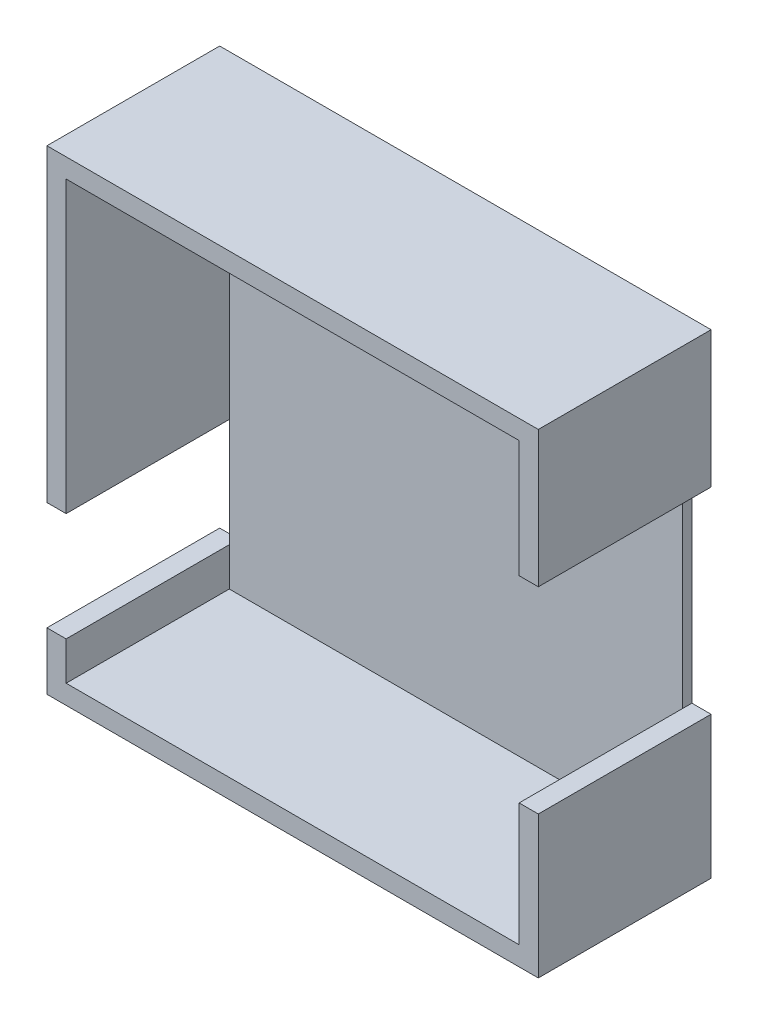
ISO-10303-21;
HEADER;
FILE_DESCRIPTION(('STEP AP214'),'2;1');
FILE_NAME('part.step','',(''),(''),'','','');
FILE_SCHEMA(('AUTOMOTIVE_DESIGN { 1 0 10303 214 1 1 1 1 }'));
ENDSEC;
DATA;
#1=APPLICATION_CONTEXT('core data for automotive mechanical design processes');
#2=APPLICATION_PROTOCOL_DEFINITION('international standard','automotive_design',2000,#1);
#3=PRODUCT_CONTEXT('',#1,'mechanical');
#4=PRODUCT('Part','Part','',(#3));
#5=PRODUCT_RELATED_PRODUCT_CATEGORY('part','',(#4));
#6=PRODUCT_DEFINITION_FORMATION('','',#4);
#7=PRODUCT_DEFINITION_CONTEXT('part definition',#1,'design');
#8=PRODUCT_DEFINITION('design','',#6,#7);
#9=PRODUCT_DEFINITION_SHAPE('','',#8);
#10=(LENGTH_UNIT() NAMED_UNIT(*) SI_UNIT(.MILLI.,.METRE.));
#11=(NAMED_UNIT(*) PLANE_ANGLE_UNIT() SI_UNIT($,.RADIAN.));
#12=(NAMED_UNIT(*) SI_UNIT($,.STERADIAN.) SOLID_ANGLE_UNIT());
#13=UNCERTAINTY_MEASURE_WITH_UNIT(LENGTH_MEASURE(1.E-05),#10,'distance_accuracy_value','');
#14=(GEOMETRIC_REPRESENTATION_CONTEXT(3) GLOBAL_UNCERTAINTY_ASSIGNED_CONTEXT((#13)) GLOBAL_UNIT_ASSIGNED_CONTEXT((#10,
#11,#12)) REPRESENTATION_CONTEXT('',''));
#15=CARTESIAN_POINT('',(0.,0.,0.));
#16=DIRECTION('',(0.,0.,1.));
#17=DIRECTION('',(1.,0.,0.));
#18=AXIS2_PLACEMENT_3D('',#15,#16,#17);
#19=CARTESIAN_POINT('',(0.,0.,17.));
#20=DIRECTION('',(0.,0.,1.));
#21=DIRECTION('',(1.,0.,0.));
#22=AXIS2_PLACEMENT_3D('',#19,#20,#21);
#23=PLANE('',#22);
#24=DIRECTION('',(1.,0.,0.));
#25=VECTOR('',#24,1.);
#26=CARTESIAN_POINT('',(25.47798502867,-32.8376623376623,17.));
#27=LINE('',#26,#25);
#28=CARTESIAN_POINT('',(23.47798502867,-32.8376623376623,17.));
#29=VERTEX_POINT('',#28);
#30=CARTESIAN_POINT('',(25.47798502867,-32.8376623376623,17.));
#31=VERTEX_POINT('',#30);
#32=EDGE_CURVE('E180',#29,#31,#27,.T.);
#33=ORIENTED_EDGE('',*,*,#32,.F.);
#34=DIRECTION('',(0.,1.,0.));
#35=VECTOR('',#34,1.);
#36=CARTESIAN_POINT('',(23.47798502867,-0.137662337662325,17.));
#37=LINE('',#36,#35);
#38=CARTESIAN_POINT('',(23.47798502867,-45.6376623376623,17.));
#39=VERTEX_POINT('',#38);
#40=EDGE_CURVE('E275',#39,#29,#37,.T.);
#41=ORIENTED_EDGE('',*,*,#40,.F.);
#42=DIRECTION('',(1.,0.,0.));
#43=VECTOR('',#42,1.);
#44=CARTESIAN_POINT('',(-23.72201497133,-45.6376623376623,17.));
#45=LINE('',#44,#43);
#46=CARTESIAN_POINT('',(-23.72201497133,-45.6376623376623,17.));
#47=VERTEX_POINT('',#46);
#48=EDGE_CURVE('E271',#47,#39,#45,.T.);
#49=ORIENTED_EDGE('',*,*,#48,.F.);
#50=DIRECTION('',(0.,-1.,0.));
#51=VECTOR('',#50,1.);
#52=CARTESIAN_POINT('',(-23.72201497133,-0.137662337662324,17.));
#53=LINE('',#52,#51);
#54=CARTESIAN_POINT('',(-23.72201497133,-41.6376623376623,17.));
#55=VERTEX_POINT('',#54);
#56=EDGE_CURVE('E272',#55,#47,#53,.T.);
#57=ORIENTED_EDGE('',*,*,#56,.F.);
#58=DIRECTION('',(1.,0.,0.));
#59=VECTOR('',#58,1.);
#60=CARTESIAN_POINT('',(-23.72201497133,-41.6376623376623,17.));
#61=LINE('',#60,#59);
#62=CARTESIAN_POINT('',(-25.72201497133,-41.6376623376623,17.));
#63=VERTEX_POINT('',#62);
#64=EDGE_CURVE('E325',#63,#55,#61,.T.);
#65=ORIENTED_EDGE('',*,*,#64,.F.);
#66=DIRECTION('',(0.,-1.,0.));
#67=VECTOR('',#66,1.);
#68=CARTESIAN_POINT('',(-25.72201497133,1.86233766233768,17.));
#69=LINE('',#68,#67);
#70=CARTESIAN_POINT('',(-25.72201497133,-47.6376623376623,17.));
#71=VERTEX_POINT('',#70);
#72=EDGE_CURVE('E312',#63,#71,#69,.T.);
#73=ORIENTED_EDGE('',*,*,#72,.T.);
#74=DIRECTION('',(1.,0.,0.));
#75=VECTOR('',#74,1.);
#76=CARTESIAN_POINT('',(-25.72201497133,-47.6376623376623,17.));
#77=LINE('',#76,#75);
#78=CARTESIAN_POINT('',(25.47798502867,-47.6376623376623,17.));
#79=VERTEX_POINT('',#78);
#80=EDGE_CURVE('E198',#71,#79,#77,.T.);
#81=ORIENTED_EDGE('',*,*,#80,.T.);
#82=DIRECTION('',(0.,1.,0.));
#83=VECTOR('',#82,1.);
#84=CARTESIAN_POINT('',(25.47798502867,1.86233766233768,17.));
#85=LINE('',#84,#83);
#86=EDGE_CURVE('E197',#79,#31,#85,.T.);
#87=ORIENTED_EDGE('',*,*,#86,.T.);
#88=EDGE_LOOP('',(#33,#41,#49,#57,#65,#73,#81,#87));
#89=FACE_BOUND('',#88,.T.);
#90=ADVANCED_FACE('F45',(#89),#23,.T.);
#91=CARTESIAN_POINT('',(-25.72201497133,1.86233766233768,17.));
#92=DIRECTION('',(1.,0.,0.));
#93=DIRECTION('',(0.,1.,0.));
#94=AXIS2_PLACEMENT_3D('',#91,#92,#93);
#95=PLANE('',#94);
#96=ORIENTED_EDGE('',*,*,#72,.F.);
#97=DIRECTION('',(0.,0.,1.));
#98=VECTOR('',#97,1.);
#99=CARTESIAN_POINT('',(-25.72201497133,-41.6376623376623,-2.));
#100=LINE('',#99,#98);
#101=CARTESIAN_POINT('',(-25.72201497133,-41.6376623376623,-1.));
#102=VERTEX_POINT('',#101);
#103=EDGE_CURVE('E336',#102,#63,#100,.T.);
#104=ORIENTED_EDGE('',*,*,#103,.F.);
#105=DIRECTION('',(0.,1.,0.));
#106=VECTOR('',#105,1.);
#107=CARTESIAN_POINT('',(-25.72201497133,1.86233766233767,-1.));
#108=LINE('',#107,#106);
#109=CARTESIAN_POINT('',(-25.72201497133,-47.6376623376623,-1.00000000000001));
#110=VERTEX_POINT('',#109);
#111=EDGE_CURVE('E259',#110,#102,#108,.T.);
#112=ORIENTED_EDGE('',*,*,#111,.F.);
#113=DIRECTION('',(0.,0.,-1.));
#114=VECTOR('',#113,1.);
#115=CARTESIAN_POINT('',(-25.72201497133,-47.6376623376623,17.));
#116=LINE('',#115,#114);
#117=EDGE_CURVE('E219',#71,#110,#116,.T.);
#118=ORIENTED_EDGE('',*,*,#117,.F.);
#119=EDGE_LOOP('',(#96,#104,#112,#118));
#120=FACE_BOUND('',#119,.T.);
#121=ADVANCED_FACE('F334',(#120),#95,.F.);
#122=CARTESIAN_POINT('',(25.47798502867,1.86233766233768,17.));
#123=DIRECTION('',(-1.,0.,0.));
#124=DIRECTION('',(0.,-1.,0.));
#125=AXIS2_PLACEMENT_3D('',#122,#123,#124);
#126=PLANE('',#125);
#127=DIRECTION('',(0.,1.,0.));
#128=VECTOR('',#127,1.);
#129=CARTESIAN_POINT('',(25.47798502867,1.86233766233768,-1.));
#130=LINE('',#129,#128);
#131=CARTESIAN_POINT('',(25.47798502867,-47.6376623376623,-1.00000000000001));
#132=VERTEX_POINT('',#131);
#133=CARTESIAN_POINT('',(25.47798502867,-32.8376623376623,-1.));
#134=VERTEX_POINT('',#133);
#135=EDGE_CURVE('E248',#132,#134,#130,.T.);
#136=ORIENTED_EDGE('',*,*,#135,.T.);
#137=DIRECTION('',(0.,0.,1.));
#138=VECTOR('',#137,1.);
#139=CARTESIAN_POINT('',(25.47798502867,-32.8376623376623,-2.));
#140=LINE('',#139,#138);
#141=EDGE_CURVE('E419',#134,#31,#140,.T.);
#142=ORIENTED_EDGE('',*,*,#141,.T.);
#143=ORIENTED_EDGE('',*,*,#86,.F.);
#144=DIRECTION('',(0.,0.,-1.));
#145=VECTOR('',#144,1.);
#146=CARTESIAN_POINT('',(25.47798502867,-47.6376623376623,17.));
#147=LINE('',#146,#145);
#148=EDGE_CURVE('E216',#79,#132,#147,.T.);
#149=ORIENTED_EDGE('',*,*,#148,.T.);
#150=EDGE_LOOP('',(#136,#142,#143,#149));
#151=FACE_BOUND('',#150,.T.);
#152=ADVANCED_FACE('F360',(#151),#126,.F.);
#153=CARTESIAN_POINT('',(-23.72201497133,-0.137662337662324,17.));
#154=DIRECTION('',(1.,0.,0.));
#155=DIRECTION('',(0.,1.,0.));
#156=AXIS2_PLACEMENT_3D('',#153,#154,#155);
#157=PLANE('',#156);
#158=DIRECTION('',(0.,0.,1.));
#159=VECTOR('',#158,1.);
#160=CARTESIAN_POINT('',(-23.72201497133,-41.6376623376623,-2.));
#161=LINE('',#160,#159);
#162=CARTESIAN_POINT('',(-23.72201497133,-41.6376623376623,0.));
#163=VERTEX_POINT('',#162);
#164=EDGE_CURVE('E410',#163,#55,#161,.T.);
#165=ORIENTED_EDGE('',*,*,#164,.T.);
#166=ORIENTED_EDGE('',*,*,#56,.T.);
#167=DIRECTION('',(0.,0.,-1.));
#168=VECTOR('',#167,1.);
#169=CARTESIAN_POINT('',(-23.72201497133,-45.6376623376623,17.));
#170=LINE('',#169,#168);
#171=CARTESIAN_POINT('',(-23.72201497133,-45.6376623376623,0.));
#172=VERTEX_POINT('',#171);
#173=EDGE_CURVE('E309',#47,#172,#170,.T.);
#174=ORIENTED_EDGE('',*,*,#173,.T.);
#175=DIRECTION('',(0.,-1.,0.));
#176=VECTOR('',#175,1.);
#177=CARTESIAN_POINT('',(-23.72201497133,-0.137662337662324,0.));
#178=LINE('',#177,#176);
#179=EDGE_CURVE('E262',#163,#172,#178,.T.);
#180=ORIENTED_EDGE('',*,*,#179,.F.);
#181=EDGE_LOOP('',(#165,#166,#174,#180));
#182=FACE_BOUND('',#181,.T.);
#183=ADVANCED_FACE('F357',(#182),#157,.T.);
#184=CARTESIAN_POINT('',(23.47798502867,-0.137662337662325,17.));
#185=DIRECTION('',(-1.,0.,0.));
#186=DIRECTION('',(0.,-1.,0.));
#187=AXIS2_PLACEMENT_3D('',#184,#185,#186);
#188=PLANE('',#187);
#189=DIRECTION('',(0.,0.,1.));
#190=VECTOR('',#189,1.);
#191=CARTESIAN_POINT('',(23.47798502867,-32.8376623376623,-2.));
#192=LINE('',#191,#190);
#193=CARTESIAN_POINT('',(23.47798502867,-32.8376623376623,0.));
#194=VERTEX_POINT('',#193);
#195=EDGE_CURVE('E397',#194,#29,#192,.T.);
#196=ORIENTED_EDGE('',*,*,#195,.F.);
#197=DIRECTION('',(0.,1.,0.));
#198=VECTOR('',#197,1.);
#199=CARTESIAN_POINT('',(23.47798502867,-0.137662337662325,0.));
#200=LINE('',#199,#198);
#201=CARTESIAN_POINT('',(23.47798502867,-45.6376623376623,0.));
#202=VERTEX_POINT('',#201);
#203=EDGE_CURVE('E292',#202,#194,#200,.T.);
#204=ORIENTED_EDGE('',*,*,#203,.F.);
#205=DIRECTION('',(0.,0.,-1.));
#206=VECTOR('',#205,1.);
#207=CARTESIAN_POINT('',(23.47798502867,-45.6376623376623,17.));
#208=LINE('',#207,#206);
#209=EDGE_CURVE('E306',#39,#202,#208,.T.);
#210=ORIENTED_EDGE('',*,*,#209,.F.);
#211=ORIENTED_EDGE('',*,*,#40,.T.);
#212=EDGE_LOOP('',(#196,#204,#210,#211));
#213=FACE_BOUND('',#212,.T.);
#214=ADVANCED_FACE('F368',(#213),#188,.T.);
#215=DIRECTION('',(-1.,0.,0.));
#216=VECTOR('',#215,1.);
#217=CARTESIAN_POINT('',(25.47798502867,-12.3376623376623,17.));
#218=LINE('',#217,#216);
#219=CARTESIAN_POINT('',(25.47798502867,-12.3376623376623,17.));
#220=VERTEX_POINT('',#219);
#221=CARTESIAN_POINT('',(23.47798502867,-12.3376623376623,17.));
#222=VERTEX_POINT('',#221);
#223=EDGE_CURVE('E171',#220,#222,#218,.T.);
#224=ORIENTED_EDGE('',*,*,#223,.F.);
#225=CARTESIAN_POINT('',(25.47798502867,1.86233766233768,17.));
#226=VERTEX_POINT('',#225);
#227=EDGE_CURVE('E185',#220,#226,#85,.T.);
#228=ORIENTED_EDGE('',*,*,#227,.T.);
#229=DIRECTION('',(-1.,0.,0.));
#230=VECTOR('',#229,1.);
#231=CARTESIAN_POINT('',(-25.72201497133,1.86233766233768,17.));
#232=LINE('',#231,#230);
#233=CARTESIAN_POINT('',(-25.72201497133,1.86233766233768,17.));
#234=VERTEX_POINT('',#233);
#235=EDGE_CURVE('E203',#226,#234,#232,.T.);
#236=ORIENTED_EDGE('',*,*,#235,.T.);
#237=CARTESIAN_POINT('',(-25.72201497133,-30.3376623376623,17.));
#238=VERTEX_POINT('',#237);
#239=EDGE_CURVE('E204',#234,#238,#69,.T.);
#240=ORIENTED_EDGE('',*,*,#239,.T.);
#241=DIRECTION('',(-1.,0.,0.));
#242=VECTOR('',#241,1.);
#243=CARTESIAN_POINT('',(-23.72201497133,-30.3376623376623,17.));
#244=LINE('',#243,#242);
#245=CARTESIAN_POINT('',(-23.72201497133,-30.3376623376623,17.));
#246=VERTEX_POINT('',#245);
#247=EDGE_CURVE('E190',#246,#238,#244,.T.);
#248=ORIENTED_EDGE('',*,*,#247,.F.);
#249=CARTESIAN_POINT('',(-23.72201497133,-0.137662337662324,17.));
#250=VERTEX_POINT('',#249);
#251=EDGE_CURVE('E267',#250,#246,#53,.T.);
#252=ORIENTED_EDGE('',*,*,#251,.F.);
#253=DIRECTION('',(-1.,0.,0.));
#254=VECTOR('',#253,1.);
#255=CARTESIAN_POINT('',(-23.72201497133,-0.137662337662324,17.));
#256=LINE('',#255,#254);
#257=CARTESIAN_POINT('',(23.47798502867,-0.137662337662325,17.));
#258=VERTEX_POINT('',#257);
#259=EDGE_CURVE('E279',#258,#250,#256,.T.);
#260=ORIENTED_EDGE('',*,*,#259,.F.);
#261=EDGE_CURVE('E188',#222,#258,#37,.T.);
#262=ORIENTED_EDGE('',*,*,#261,.F.);
#263=EDGE_LOOP('',(#224,#228,#236,#240,#248,#252,#260,#262));
#264=FACE_BOUND('',#263,.T.);
#265=ADVANCED_FACE('F184',(#264),#23,.T.);
#266=CARTESIAN_POINT('',(-25.72201497133,-30.3376623376623,-1.));
#267=VERTEX_POINT('',#266);
#268=CARTESIAN_POINT('',(-25.72201497133,1.86233766233767,-1.));
#269=VERTEX_POINT('',#268);
#270=EDGE_CURVE('E254',#267,#269,#108,.T.);
#271=ORIENTED_EDGE('',*,*,#270,.F.);
#272=DIRECTION('',(0.,0.,1.));
#273=VECTOR('',#272,1.);
#274=CARTESIAN_POINT('',(-25.72201497133,-30.3376623376623,-2.));
#275=LINE('',#274,#273);
#276=EDGE_CURVE('E69',#267,#238,#275,.T.);
#277=ORIENTED_EDGE('',*,*,#276,.T.);
#278=ORIENTED_EDGE('',*,*,#239,.F.);
#279=DIRECTION('',(0.,0.,-1.));
#280=VECTOR('',#279,1.);
#281=CARTESIAN_POINT('',(-25.72201497133,1.86233766233768,17.));
#282=LINE('',#281,#280);
#283=EDGE_CURVE('E210',#234,#269,#282,.T.);
#284=ORIENTED_EDGE('',*,*,#283,.T.);
#285=EDGE_LOOP('',(#271,#277,#278,#284));
#286=FACE_BOUND('',#285,.T.);
#287=ADVANCED_FACE('F47',(#286),#95,.F.);
#288=CARTESIAN_POINT('',(-25.72201497133,-47.6376623376623,17.));
#289=DIRECTION('',(0.,1.,0.));
#290=DIRECTION('',(0.,0.,1.));
#291=AXIS2_PLACEMENT_3D('',#288,#289,#290);
#292=PLANE('',#291);
#293=ORIENTED_EDGE('',*,*,#117,.T.);
#294=DIRECTION('',(1.,0.,0.));
#295=VECTOR('',#294,1.);
#296=CARTESIAN_POINT('',(-25.72201497133,-47.6376623376623,-1.00000000000001));
#297=LINE('',#296,#295);
#298=EDGE_CURVE('E263',#110,#132,#297,.T.);
#299=ORIENTED_EDGE('',*,*,#298,.T.);
#300=ORIENTED_EDGE('',*,*,#148,.F.);
#301=ORIENTED_EDGE('',*,*,#80,.F.);
#302=EDGE_LOOP('',(#293,#299,#300,#301));
#303=FACE_BOUND('',#302,.T.);
#304=ADVANCED_FACE('F330',(#303),#292,.F.);
#305=ORIENTED_EDGE('',*,*,#227,.F.);
#306=DIRECTION('',(0.,0.,1.));
#307=VECTOR('',#306,1.);
#308=CARTESIAN_POINT('',(25.47798502867,-12.3376623376623,-2.));
#309=LINE('',#308,#307);
#310=CARTESIAN_POINT('',(25.47798502867,-12.3376623376623,-1.));
#311=VERTEX_POINT('',#310);
#312=EDGE_CURVE('E168',#311,#220,#309,.T.);
#313=ORIENTED_EDGE('',*,*,#312,.F.);
#314=CARTESIAN_POINT('',(25.47798502867,1.86233766233768,-1.));
#315=VERTEX_POINT('',#314);
#316=EDGE_CURVE('E244',#311,#315,#130,.T.);
#317=ORIENTED_EDGE('',*,*,#316,.T.);
#318=DIRECTION('',(0.,0.,-1.));
#319=VECTOR('',#318,1.);
#320=CARTESIAN_POINT('',(25.47798502867,1.86233766233768,17.));
#321=LINE('',#320,#319);
#322=EDGE_CURVE('E194',#226,#315,#321,.T.);
#323=ORIENTED_EDGE('',*,*,#322,.F.);
#324=EDGE_LOOP('',(#305,#313,#317,#323));
#325=FACE_BOUND('',#324,.T.);
#326=ADVANCED_FACE('F192',(#325),#126,.F.);
#327=CARTESIAN_POINT('',(-25.72201497133,1.86233766233768,17.));
#328=DIRECTION('',(0.,-1.,0.));
#329=DIRECTION('',(0.,0.,-1.));
#330=AXIS2_PLACEMENT_3D('',#327,#328,#329);
#331=PLANE('',#330);
#332=ORIENTED_EDGE('',*,*,#322,.T.);
#333=DIRECTION('',(1.,0.,0.));
#334=VECTOR('',#333,1.);
#335=CARTESIAN_POINT('',(-25.72201497133,1.86233766233767,-1.));
#336=LINE('',#335,#334);
#337=EDGE_CURVE('E246',#269,#315,#336,.T.);
#338=ORIENTED_EDGE('',*,*,#337,.F.);
#339=ORIENTED_EDGE('',*,*,#283,.F.);
#340=ORIENTED_EDGE('',*,*,#235,.F.);
#341=EDGE_LOOP('',(#332,#338,#339,#340));
#342=FACE_BOUND('',#341,.T.);
#343=ADVANCED_FACE('F345',(#342),#331,.F.);
#344=DIRECTION('',(0.,0.,1.));
#345=VECTOR('',#344,1.);
#346=CARTESIAN_POINT('',(-23.72201497133,-30.3376623376623,-2.));
#347=LINE('',#346,#345);
#348=CARTESIAN_POINT('',(-23.72201497133,-30.3376623376623,0.));
#349=VERTEX_POINT('',#348);
#350=EDGE_CURVE('E401',#349,#246,#347,.T.);
#351=ORIENTED_EDGE('',*,*,#350,.F.);
#352=CARTESIAN_POINT('',(-23.72201497133,-0.137662337662324,0.));
#353=VERTEX_POINT('',#352);
#354=EDGE_CURVE('E283',#353,#349,#178,.T.);
#355=ORIENTED_EDGE('',*,*,#354,.F.);
#356=DIRECTION('',(0.,0.,-1.));
#357=VECTOR('',#356,1.);
#358=CARTESIAN_POINT('',(-23.72201497133,-0.137662337662324,17.));
#359=LINE('',#358,#357);
#360=EDGE_CURVE('E282',#250,#353,#359,.T.);
#361=ORIENTED_EDGE('',*,*,#360,.F.);
#362=ORIENTED_EDGE('',*,*,#251,.T.);
#363=EDGE_LOOP('',(#351,#355,#361,#362));
#364=FACE_BOUND('',#363,.T.);
#365=ADVANCED_FACE('F347',(#364),#157,.T.);
#366=CARTESIAN_POINT('',(-23.72201497133,-45.6376623376623,17.));
#367=DIRECTION('',(0.,1.,0.));
#368=DIRECTION('',(0.,0.,1.));
#369=AXIS2_PLACEMENT_3D('',#366,#367,#368);
#370=PLANE('',#369);
#371=DIRECTION('',(1.,0.,0.));
#372=VECTOR('',#371,1.);
#373=CARTESIAN_POINT('',(-23.72201497133,-45.6376623376623,0.));
#374=LINE('',#373,#372);
#375=EDGE_CURVE('E287',#172,#202,#374,.T.);
#376=ORIENTED_EDGE('',*,*,#375,.F.);
#377=ORIENTED_EDGE('',*,*,#173,.F.);
#378=ORIENTED_EDGE('',*,*,#48,.T.);
#379=ORIENTED_EDGE('',*,*,#209,.T.);
#380=EDGE_LOOP('',(#376,#377,#378,#379));
#381=FACE_BOUND('',#380,.T.);
#382=ADVANCED_FACE('F354',(#381),#370,.T.);
#383=DIRECTION('',(0.,0.,1.));
#384=VECTOR('',#383,1.);
#385=CARTESIAN_POINT('',(23.47798502867,-12.3376623376623,-2.));
#386=LINE('',#385,#384);
#387=CARTESIAN_POINT('',(23.47798502867,-12.3376623376623,0.));
#388=VERTEX_POINT('',#387);
#389=EDGE_CURVE('E179',#388,#222,#386,.T.);
#390=ORIENTED_EDGE('',*,*,#389,.T.);
#391=ORIENTED_EDGE('',*,*,#261,.T.);
#392=DIRECTION('',(0.,0.,-1.));
#393=VECTOR('',#392,1.);
#394=CARTESIAN_POINT('',(23.47798502867,-0.137662337662325,17.));
#395=LINE('',#394,#393);
#396=CARTESIAN_POINT('',(23.47798502867,-0.137662337662325,0.));
#397=VERTEX_POINT('',#396);
#398=EDGE_CURVE('E302',#258,#397,#395,.T.);
#399=ORIENTED_EDGE('',*,*,#398,.T.);
#400=EDGE_CURVE('E291',#388,#397,#200,.T.);
#401=ORIENTED_EDGE('',*,*,#400,.F.);
#402=EDGE_LOOP('',(#390,#391,#399,#401));
#403=FACE_BOUND('',#402,.T.);
#404=ADVANCED_FACE('F375',(#403),#188,.T.);
#405=CARTESIAN_POINT('',(-23.72201497133,-0.137662337662324,17.));
#406=DIRECTION('',(0.,-1.,0.));
#407=DIRECTION('',(1.,0.,0.));
#408=AXIS2_PLACEMENT_3D('',#405,#406,#407);
#409=PLANE('',#408);
#410=DIRECTION('',(-1.,0.,0.));
#411=VECTOR('',#410,1.);
#412=CARTESIAN_POINT('',(-23.72201497133,-0.137662337662324,0.));
#413=LINE('',#412,#411);
#414=EDGE_CURVE('E296',#397,#353,#413,.T.);
#415=ORIENTED_EDGE('',*,*,#414,.F.);
#416=ORIENTED_EDGE('',*,*,#398,.F.);
#417=ORIENTED_EDGE('',*,*,#259,.T.);
#418=ORIENTED_EDGE('',*,*,#360,.T.);
#419=EDGE_LOOP('',(#415,#416,#417,#418));
#420=FACE_BOUND('',#419,.T.);
#421=ADVANCED_FACE('F384',(#420),#409,.T.);
#422=CARTESIAN_POINT('',(-25.72201497133,1.86233766233767,0.));
#423=DIRECTION('',(0.,0.,1.));
#424=DIRECTION('',(0.,-1.,0.));
#425=AXIS2_PLACEMENT_3D('',#422,#423,#424);
#426=PLANE('',#425);
#427=ORIENTED_EDGE('',*,*,#414,.T.);
#428=ORIENTED_EDGE('',*,*,#354,.T.);
#429=DIRECTION('',(0.,1.,0.));
#430=VECTOR('',#429,1.);
#431=CARTESIAN_POINT('',(-23.72201497133,1.86233766233767,0.));
#432=LINE('',#431,#430);
#433=EDGE_CURVE('E255',#163,#349,#432,.T.);
#434=ORIENTED_EDGE('',*,*,#433,.F.);
#435=ORIENTED_EDGE('',*,*,#179,.T.);
#436=ORIENTED_EDGE('',*,*,#375,.T.);
#437=ORIENTED_EDGE('',*,*,#203,.T.);
#438=DIRECTION('',(0.,-1.,0.));
#439=VECTOR('',#438,1.);
#440=CARTESIAN_POINT('',(23.47798502867,1.86233766233767,0.));
#441=LINE('',#440,#439);
#442=EDGE_CURVE('E249',#388,#194,#441,.T.);
#443=ORIENTED_EDGE('',*,*,#442,.F.);
#444=ORIENTED_EDGE('',*,*,#400,.T.);
#445=EDGE_LOOP('',(#427,#428,#434,#435,#436,#437,#443,#444));
#446=FACE_BOUND('',#445,.T.);
#447=ADVANCED_FACE('F389',(#446),#426,.T.);
#448=CARTESIAN_POINT('',(-25.72201497133,1.86233766233767,-1.));
#449=DIRECTION('',(0.,0.,-1.));
#450=DIRECTION('',(0.,1.,0.));
#451=AXIS2_PLACEMENT_3D('',#448,#449,#450);
#452=PLANE('',#451);
#453=DIRECTION('',(-1.,0.,0.));
#454=VECTOR('',#453,1.);
#455=CARTESIAN_POINT('',(-25.72201497133,-32.8376623376623,-1.));
#456=LINE('',#455,#454);
#457=CARTESIAN_POINT('',(23.47798502867,-32.8376623376623,-1.));
#458=VERTEX_POINT('',#457);
#459=EDGE_CURVE('E11',#134,#458,#456,.T.);
#460=ORIENTED_EDGE('',*,*,#459,.F.);
#461=ORIENTED_EDGE('',*,*,#135,.F.);
#462=ORIENTED_EDGE('',*,*,#298,.F.);
#463=ORIENTED_EDGE('',*,*,#111,.T.);
#464=DIRECTION('',(-1.,0.,0.));
#465=VECTOR('',#464,1.);
#466=CARTESIAN_POINT('',(-25.72201497133,-41.6376623376623,-1.00000000000001));
#467=LINE('',#466,#465);
#468=CARTESIAN_POINT('',(-23.72201497133,-41.6376623376623,-1.00000000000001));
#469=VERTEX_POINT('',#468);
#470=EDGE_CURVE('E228',#469,#102,#467,.T.);
#471=ORIENTED_EDGE('',*,*,#470,.F.);
#472=DIRECTION('',(0.,-1.,0.));
#473=VECTOR('',#472,1.);
#474=CARTESIAN_POINT('',(-23.72201497133,1.86233766233767,-1.));
#475=LINE('',#474,#473);
#476=CARTESIAN_POINT('',(-23.72201497133,-30.3376623376623,-1.));
#477=VERTEX_POINT('',#476);
#478=EDGE_CURVE('E225',#477,#469,#475,.T.);
#479=ORIENTED_EDGE('',*,*,#478,.F.);
#480=DIRECTION('',(1.,0.,0.));
#481=VECTOR('',#480,1.);
#482=CARTESIAN_POINT('',(-25.72201497133,-30.3376623376623,-1.));
#483=LINE('',#482,#481);
#484=EDGE_CURVE('E222',#267,#477,#483,.T.);
#485=ORIENTED_EDGE('',*,*,#484,.F.);
#486=ORIENTED_EDGE('',*,*,#270,.T.);
#487=ORIENTED_EDGE('',*,*,#337,.T.);
#488=ORIENTED_EDGE('',*,*,#316,.F.);
#489=DIRECTION('',(1.,0.,0.));
#490=VECTOR('',#489,1.);
#491=CARTESIAN_POINT('',(-25.72201497133,-12.3376623376623,-1.));
#492=LINE('',#491,#490);
#493=CARTESIAN_POINT('',(23.47798502867,-12.3376623376623,-1.));
#494=VERTEX_POINT('',#493);
#495=EDGE_CURVE('E174',#494,#311,#492,.T.);
#496=ORIENTED_EDGE('',*,*,#495,.F.);
#497=DIRECTION('',(0.,1.,0.));
#498=VECTOR('',#497,1.);
#499=CARTESIAN_POINT('',(23.47798502867,1.86233766233767,-1.));
#500=LINE('',#499,#498);
#501=EDGE_CURVE('E54',#458,#494,#500,.T.);
#502=ORIENTED_EDGE('',*,*,#501,.F.);
#503=EDGE_LOOP('',(#460,#461,#462,#463,#471,#479,#485,#486,#487,#488,#496,#502));
#504=FACE_BOUND('',#503,.T.);
#505=ADVANCED_FACE('F242',(#504),#452,.T.);
#506=CARTESIAN_POINT('',(-23.72201497133,-41.6376623376623,-2.));
#507=DIRECTION('',(1.,0.,0.));
#508=DIRECTION('',(0.,0.,-1.));
#509=AXIS2_PLACEMENT_3D('',#506,#507,#508);
#510=PLANE('',#509);
#511=ORIENTED_EDGE('',*,*,#433,.T.);
#512=EDGE_CURVE('E404',#477,#349,#347,.T.);
#513=ORIENTED_EDGE('',*,*,#512,.F.);
#514=ORIENTED_EDGE('',*,*,#478,.T.);
#515=EDGE_CURVE('E409',#469,#163,#161,.T.);
#516=ORIENTED_EDGE('',*,*,#515,.T.);
#517=EDGE_LOOP('',(#511,#513,#514,#516));
#518=FACE_BOUND('',#517,.T.);
#519=ADVANCED_FACE('F447',(#518),#510,.F.);
#520=CARTESIAN_POINT('',(-23.72201497133,-41.6376623376623,-2.));
#521=DIRECTION('',(0.,-1.,0.));
#522=DIRECTION('',(0.,0.,-1.));
#523=AXIS2_PLACEMENT_3D('',#520,#521,#522);
#524=PLANE('',#523);
#525=ORIENTED_EDGE('',*,*,#470,.T.);
#526=ORIENTED_EDGE('',*,*,#103,.T.);
#527=ORIENTED_EDGE('',*,*,#64,.T.);
#528=ORIENTED_EDGE('',*,*,#164,.F.);
#529=ORIENTED_EDGE('',*,*,#515,.F.);
#530=EDGE_LOOP('',(#525,#526,#527,#528,#529));
#531=FACE_BOUND('',#530,.T.);
#532=ADVANCED_FACE('F446',(#531),#524,.F.);
#533=CARTESIAN_POINT('',(-23.72201497133,-30.3376623376623,-2.));
#534=DIRECTION('',(0.,1.,0.));
#535=DIRECTION('',(0.,0.,1.));
#536=AXIS2_PLACEMENT_3D('',#533,#534,#535);
#537=PLANE('',#536);
#538=ORIENTED_EDGE('',*,*,#484,.T.);
#539=ORIENTED_EDGE('',*,*,#512,.T.);
#540=ORIENTED_EDGE('',*,*,#350,.T.);
#541=ORIENTED_EDGE('',*,*,#247,.T.);
#542=ORIENTED_EDGE('',*,*,#276,.F.);
#543=EDGE_LOOP('',(#538,#539,#540,#541,#542));
#544=FACE_BOUND('',#543,.T.);
#545=ADVANCED_FACE('F451',(#544),#537,.F.);
#546=CARTESIAN_POINT('',(25.47798502867,-32.8376623376623,-2.));
#547=DIRECTION('',(0.,-1.,0.));
#548=DIRECTION('',(0.,0.,-1.));
#549=AXIS2_PLACEMENT_3D('',#546,#547,#548);
#550=PLANE('',#549);
#551=ORIENTED_EDGE('',*,*,#459,.T.);
#552=EDGE_CURVE('E239',#458,#194,#192,.T.);
#553=ORIENTED_EDGE('',*,*,#552,.T.);
#554=ORIENTED_EDGE('',*,*,#195,.T.);
#555=ORIENTED_EDGE('',*,*,#32,.T.);
#556=ORIENTED_EDGE('',*,*,#141,.F.);
#557=EDGE_LOOP('',(#551,#553,#554,#555,#556));
#558=FACE_BOUND('',#557,.T.);
#559=ADVANCED_FACE('F432',(#558),#550,.F.);
#560=CARTESIAN_POINT('',(23.47798502867,-12.3376623376623,-2.));
#561=DIRECTION('',(-1.,0.,0.));
#562=DIRECTION('',(0.,-1.,0.));
#563=AXIS2_PLACEMENT_3D('',#560,#561,#562);
#564=PLANE('',#563);
#565=ORIENTED_EDGE('',*,*,#442,.T.);
#566=ORIENTED_EDGE('',*,*,#552,.F.);
#567=ORIENTED_EDGE('',*,*,#501,.T.);
#568=EDGE_CURVE('E61',#494,#388,#386,.T.);
#569=ORIENTED_EDGE('',*,*,#568,.T.);
#570=EDGE_LOOP('',(#565,#566,#567,#569));
#571=FACE_BOUND('',#570,.T.);
#572=ADVANCED_FACE('F236',(#571),#564,.F.);
#573=CARTESIAN_POINT('',(25.47798502867,-12.3376623376623,-2.));
#574=DIRECTION('',(0.,1.,0.));
#575=DIRECTION('',(0.,0.,1.));
#576=AXIS2_PLACEMENT_3D('',#573,#574,#575);
#577=PLANE('',#576);
#578=ORIENTED_EDGE('',*,*,#495,.T.);
#579=ORIENTED_EDGE('',*,*,#312,.T.);
#580=ORIENTED_EDGE('',*,*,#223,.T.);
#581=ORIENTED_EDGE('',*,*,#389,.F.);
#582=ORIENTED_EDGE('',*,*,#568,.F.);
#583=EDGE_LOOP('',(#578,#579,#580,#581,#582));
#584=FACE_BOUND('',#583,.T.);
#585=ADVANCED_FACE('F170',(#584),#577,.F.);
#586=CLOSED_SHELL('',(#90,#121,#152,#183,#214,#265,#287,#304,#326,#343,#365,#382,#404,#421,#447,
#505,#519,#532,#545,#559,#572,#585));
#587=MANIFOLD_SOLID_BREP('B2',#586);
#588=ADVANCED_BREP_SHAPE_REPRESENTATION('',(#18,#587),#14);
#589=SHAPE_DEFINITION_REPRESENTATION(#9,#588);
ENDSEC;
END-ISO-10303-21;
